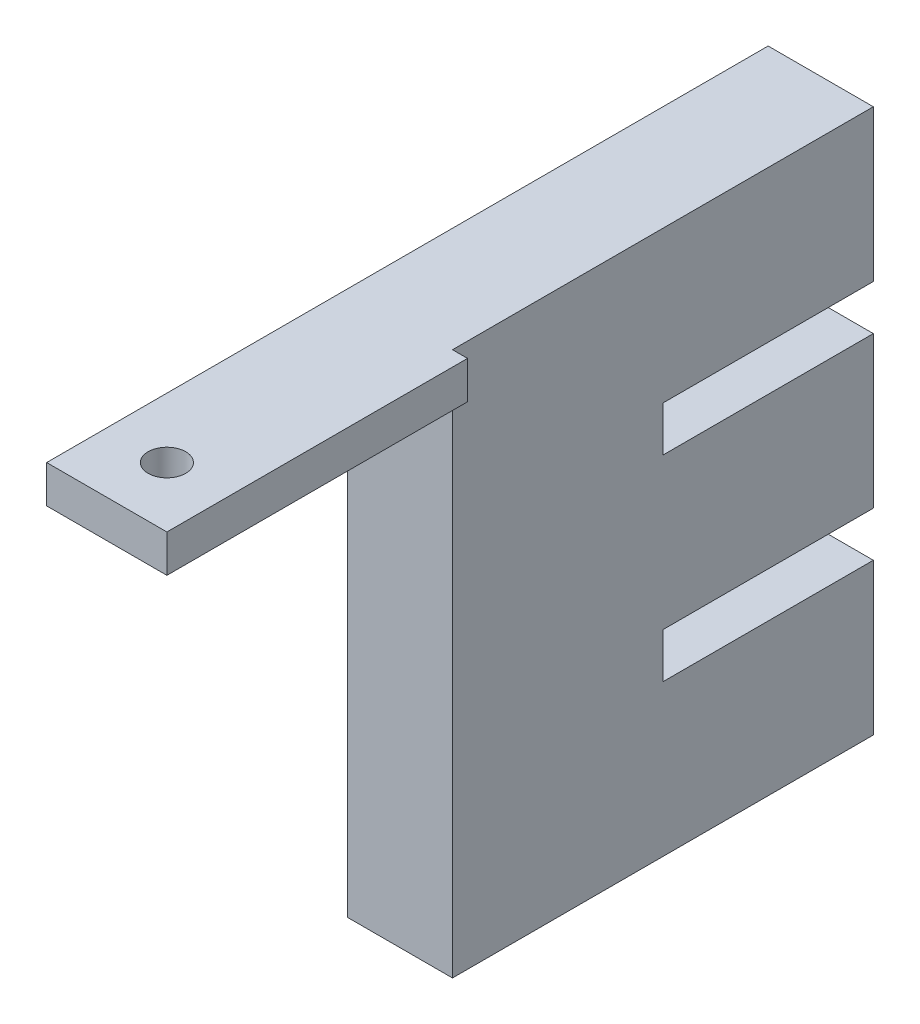
ISO-10303-21;
HEADER;
FILE_DESCRIPTION(('STEP AP214'),'2;1');
FILE_NAME('part.step','',(''),(''),'','','');
FILE_SCHEMA(('AUTOMOTIVE_DESIGN { 1 0 10303 214 1 1 1 1 }'));
ENDSEC;
DATA;
#1=APPLICATION_CONTEXT('core data for automotive mechanical design processes');
#2=APPLICATION_PROTOCOL_DEFINITION('international standard','automotive_design',2000,#1);
#3=PRODUCT_CONTEXT('',#1,'mechanical');
#4=PRODUCT('Part','Part','',(#3));
#5=PRODUCT_RELATED_PRODUCT_CATEGORY('part','',(#4));
#6=PRODUCT_DEFINITION_FORMATION('','',#4);
#7=PRODUCT_DEFINITION_CONTEXT('part definition',#1,'design');
#8=PRODUCT_DEFINITION('design','',#6,#7);
#9=PRODUCT_DEFINITION_SHAPE('','',#8);
#10=(LENGTH_UNIT() NAMED_UNIT(*) SI_UNIT(.MILLI.,.METRE.));
#11=(NAMED_UNIT(*) PLANE_ANGLE_UNIT() SI_UNIT($,.RADIAN.));
#12=(NAMED_UNIT(*) SI_UNIT($,.STERADIAN.) SOLID_ANGLE_UNIT());
#13=UNCERTAINTY_MEASURE_WITH_UNIT(LENGTH_MEASURE(1.E-05),#10,'distance_accuracy_value','');
#14=(GEOMETRIC_REPRESENTATION_CONTEXT(3) GLOBAL_UNCERTAINTY_ASSIGNED_CONTEXT((#13)) GLOBAL_UNIT_ASSIGNED_CONTEXT((#10,
#11,#12)) REPRESENTATION_CONTEXT('',''));
#15=CARTESIAN_POINT('',(0.,0.,0.));
#16=DIRECTION('',(0.,0.,1.));
#17=DIRECTION('',(1.,0.,0.));
#18=AXIS2_PLACEMENT_3D('',#15,#16,#17);
#19=CARTESIAN_POINT('',(-4.,4.5,4.));
#20=DIRECTION('',(1.,0.,0.));
#21=DIRECTION('',(0.,0.,-1.));
#22=AXIS2_PLACEMENT_3D('',#19,#20,#21);
#23=PLANE('',#22);
#24=DIRECTION('',(0.,0.,1.));
#25=VECTOR('',#24,1.);
#26=CARTESIAN_POINT('',(-4.,-21.63,4.));
#27=LINE('',#26,#25);
#28=CARTESIAN_POINT('',(-4.,-21.63,-44.));
#29=VERTEX_POINT('',#28);
#30=CARTESIAN_POINT('',(-4.,-21.63,-30.));
#31=VERTEX_POINT('',#30);
#32=EDGE_CURVE('E172',#29,#31,#27,.T.);
#33=ORIENTED_EDGE('',*,*,#32,.F.);
#34=DIRECTION('',(0.,-1.,0.));
#35=VECTOR('',#34,1.);
#36=CARTESIAN_POINT('',(-4.,4.5,-44.));
#37=LINE('',#36,#35);
#38=CARTESIAN_POINT('',(-4.,-31.7,-44.));
#39=VERTEX_POINT('',#38);
#40=EDGE_CURVE('E200',#29,#39,#37,.T.);
#41=ORIENTED_EDGE('',*,*,#40,.T.);
#42=DIRECTION('',(0.,0.,-1.));
#43=VECTOR('',#42,1.);
#44=CARTESIAN_POINT('',(-4.,-31.7,-16.));
#45=LINE('',#44,#43);
#46=CARTESIAN_POINT('',(-4.,-31.7,-16.));
#47=VERTEX_POINT('',#46);
#48=EDGE_CURVE('E223',#47,#39,#45,.T.);
#49=ORIENTED_EDGE('',*,*,#48,.F.);
#50=DIRECTION('',(0.,-1.,0.));
#51=VECTOR('',#50,1.);
#52=CARTESIAN_POINT('',(-4.,4.5,-16.));
#53=LINE('',#52,#51);
#54=CARTESIAN_POINT('',(-4.,2.,-16.));
#55=VERTEX_POINT('',#54);
#56=EDGE_CURVE('E199',#55,#47,#53,.T.);
#57=ORIENTED_EDGE('',*,*,#56,.F.);
#58=DIRECTION('',(0.,0.,-1.));
#59=VECTOR('',#58,1.);
#60=CARTESIAN_POINT('',(-4.,2.,4.));
#61=LINE('',#60,#59);
#62=CARTESIAN_POINT('',(-4.,2.,4.));
#63=VERTEX_POINT('',#62);
#64=EDGE_CURVE('E255',#63,#55,#61,.T.);
#65=ORIENTED_EDGE('',*,*,#64,.F.);
#66=DIRECTION('',(0.,-1.,0.));
#67=VECTOR('',#66,1.);
#68=CARTESIAN_POINT('',(-4.,4.5,4.));
#69=LINE('',#68,#67);
#70=CARTESIAN_POINT('',(-4.,4.5,4.));
#71=VERTEX_POINT('',#70);
#72=EDGE_CURVE('E230',#71,#63,#69,.T.);
#73=ORIENTED_EDGE('',*,*,#72,.F.);
#74=DIRECTION('',(0.,0.,-1.));
#75=VECTOR('',#74,1.);
#76=CARTESIAN_POINT('',(-4.,4.5,4.));
#77=LINE('',#76,#75);
#78=CARTESIAN_POINT('',(-4.,4.5,-44.));
#79=VERTEX_POINT('',#78);
#80=EDGE_CURVE('E239',#71,#79,#77,.T.);
#81=ORIENTED_EDGE('',*,*,#80,.T.);
#82=CARTESIAN_POINT('',(-4.,-5.57,-44.));
#83=VERTEX_POINT('',#82);
#84=EDGE_CURVE('E209',#79,#83,#37,.T.);
#85=ORIENTED_EDGE('',*,*,#84,.T.);
#86=DIRECTION('',(0.,0.,-1.));
#87=VECTOR('',#86,1.);
#88=CARTESIAN_POINT('',(-4.,-5.57,4.));
#89=LINE('',#88,#87);
#90=CARTESIAN_POINT('',(-4.,-5.57,-30.));
#91=VERTEX_POINT('',#90);
#92=EDGE_CURVE('E63',#91,#83,#89,.T.);
#93=ORIENTED_EDGE('',*,*,#92,.F.);
#94=DIRECTION('',(0.,-1.,0.));
#95=VECTOR('',#94,1.);
#96=CARTESIAN_POINT('',(-4.,4.5,-30.));
#97=LINE('',#96,#95);
#98=CARTESIAN_POINT('',(-4.,-8.57,-30.));
#99=VERTEX_POINT('',#98);
#100=EDGE_CURVE('E192',#91,#99,#97,.T.);
#101=ORIENTED_EDGE('',*,*,#100,.T.);
#102=DIRECTION('',(0.,0.,1.));
#103=VECTOR('',#102,1.);
#104=CARTESIAN_POINT('',(-4.,-8.57,4.));
#105=LINE('',#104,#103);
#106=CARTESIAN_POINT('',(-4.,-8.57,-44.));
#107=VERTEX_POINT('',#106);
#108=EDGE_CURVE('E186',#107,#99,#105,.T.);
#109=ORIENTED_EDGE('',*,*,#108,.F.);
#110=CARTESIAN_POINT('',(-4.,-18.63,-44.));
#111=VERTEX_POINT('',#110);
#112=EDGE_CURVE('E212',#107,#111,#37,.T.);
#113=ORIENTED_EDGE('',*,*,#112,.T.);
#114=DIRECTION('',(0.,0.,-1.));
#115=VECTOR('',#114,1.);
#116=CARTESIAN_POINT('',(-4.,-18.63,4.));
#117=LINE('',#116,#115);
#118=CARTESIAN_POINT('',(-4.,-18.63,-30.));
#119=VERTEX_POINT('',#118);
#120=EDGE_CURVE('E52',#119,#111,#117,.T.);
#121=ORIENTED_EDGE('',*,*,#120,.F.);
#122=DIRECTION('',(0.,-1.,0.));
#123=VECTOR('',#122,1.);
#124=CARTESIAN_POINT('',(-4.,4.5,-30.));
#125=LINE('',#124,#123);
#126=EDGE_CURVE('E161',#119,#31,#125,.T.);
#127=ORIENTED_EDGE('',*,*,#126,.T.);
#128=EDGE_LOOP('',(#33,#41,#49,#57,#65,#73,#81,#85,#93,#101,#109,#113,#121,#127));
#129=FACE_BOUND('',#128,.T.);
#130=ADVANCED_FACE('F39',(#129),#23,.F.);
#131=CARTESIAN_POINT('',(3.,-31.7,-16.));
#132=DIRECTION('',(-1.,0.,0.));
#133=DIRECTION('',(0.,0.,1.));
#134=AXIS2_PLACEMENT_3D('',#131,#132,#133);
#135=PLANE('',#134);
#136=DIRECTION('',(0.,0.,-1.));
#137=VECTOR('',#136,1.);
#138=CARTESIAN_POINT('',(3.,-21.63,-16.));
#139=LINE('',#138,#137);
#140=CARTESIAN_POINT('',(3.,-21.63,-30.));
#141=VERTEX_POINT('',#140);
#142=CARTESIAN_POINT('',(3.,-21.63,-44.));
#143=VERTEX_POINT('',#142);
#144=EDGE_CURVE('E170',#141,#143,#139,.T.);
#145=ORIENTED_EDGE('',*,*,#144,.F.);
#146=DIRECTION('',(0.,1.,0.));
#147=VECTOR('',#146,1.);
#148=CARTESIAN_POINT('',(3.,-31.7,-30.));
#149=LINE('',#148,#147);
#150=CARTESIAN_POINT('',(3.,-18.63,-30.));
#151=VERTEX_POINT('',#150);
#152=EDGE_CURVE('E11',#141,#151,#149,.T.);
#153=ORIENTED_EDGE('',*,*,#152,.T.);
#154=DIRECTION('',(0.,0.,1.));
#155=VECTOR('',#154,1.);
#156=CARTESIAN_POINT('',(3.,-18.63,-16.));
#157=LINE('',#156,#155);
#158=CARTESIAN_POINT('',(3.,-18.63,-44.));
#159=VERTEX_POINT('',#158);
#160=EDGE_CURVE('E146',#159,#151,#157,.T.);
#161=ORIENTED_EDGE('',*,*,#160,.F.);
#162=DIRECTION('',(0.,1.,0.));
#163=VECTOR('',#162,1.);
#164=CARTESIAN_POINT('',(3.,-31.7,-44.));
#165=LINE('',#164,#163);
#166=CARTESIAN_POINT('',(3.,-8.57,-44.));
#167=VERTEX_POINT('',#166);
#168=EDGE_CURVE('E217',#159,#167,#165,.T.);
#169=ORIENTED_EDGE('',*,*,#168,.T.);
#170=DIRECTION('',(0.,0.,-1.));
#171=VECTOR('',#170,1.);
#172=CARTESIAN_POINT('',(3.,-8.57,-16.));
#173=LINE('',#172,#171);
#174=CARTESIAN_POINT('',(3.,-8.57,-30.));
#175=VERTEX_POINT('',#174);
#176=EDGE_CURVE('E189',#175,#167,#173,.T.);
#177=ORIENTED_EDGE('',*,*,#176,.F.);
#178=DIRECTION('',(0.,1.,0.));
#179=VECTOR('',#178,1.);
#180=CARTESIAN_POINT('',(3.,-31.7,-30.));
#181=LINE('',#180,#179);
#182=CARTESIAN_POINT('',(3.,-5.57,-30.));
#183=VERTEX_POINT('',#182);
#184=EDGE_CURVE('E263',#175,#183,#181,.T.);
#185=ORIENTED_EDGE('',*,*,#184,.T.);
#186=DIRECTION('',(0.,0.,1.));
#187=VECTOR('',#186,1.);
#188=CARTESIAN_POINT('',(3.,-5.57,-16.));
#189=LINE('',#188,#187);
#190=CARTESIAN_POINT('',(3.,-5.57,-44.));
#191=VERTEX_POINT('',#190);
#192=EDGE_CURVE('E184',#191,#183,#189,.T.);
#193=ORIENTED_EDGE('',*,*,#192,.F.);
#194=CARTESIAN_POINT('',(3.,4.5,-44.));
#195=VERTEX_POINT('',#194);
#196=EDGE_CURVE('E216',#191,#195,#165,.T.);
#197=ORIENTED_EDGE('',*,*,#196,.T.);
#198=DIRECTION('',(0.,0.,-1.));
#199=VECTOR('',#198,1.);
#200=CARTESIAN_POINT('',(3.,4.5,-16.));
#201=LINE('',#200,#199);
#202=CARTESIAN_POINT('',(3.,4.5,-16.));
#203=VERTEX_POINT('',#202);
#204=EDGE_CURVE('E208',#203,#195,#201,.T.);
#205=ORIENTED_EDGE('',*,*,#204,.F.);
#206=DIRECTION('',(0.,1.,0.));
#207=VECTOR('',#206,1.);
#208=CARTESIAN_POINT('',(3.,-31.7,-16.));
#209=LINE('',#208,#207);
#210=CARTESIAN_POINT('',(3.,2.,-16.));
#211=VERTEX_POINT('',#210);
#212=EDGE_CURVE('E207',#211,#203,#209,.T.);
#213=ORIENTED_EDGE('',*,*,#212,.F.);
#214=CARTESIAN_POINT('',(3.,-31.7,-16.));
#215=VERTEX_POINT('',#214);
#216=EDGE_CURVE('E202',#215,#211,#209,.T.);
#217=ORIENTED_EDGE('',*,*,#216,.F.);
#218=DIRECTION('',(0.,0.,-1.));
#219=VECTOR('',#218,1.);
#220=CARTESIAN_POINT('',(3.,-31.7,-16.));
#221=LINE('',#220,#219);
#222=CARTESIAN_POINT('',(3.,-31.7,-44.));
#223=VERTEX_POINT('',#222);
#224=EDGE_CURVE('E224',#215,#223,#221,.T.);
#225=ORIENTED_EDGE('',*,*,#224,.T.);
#226=EDGE_CURVE('E168',#223,#143,#165,.T.);
#227=ORIENTED_EDGE('',*,*,#226,.T.);
#228=EDGE_LOOP('',(#145,#153,#161,#169,#177,#185,#193,#197,#205,#213,#217,#225,#227));
#229=FACE_BOUND('',#228,.T.);
#230=ADVANCED_FACE('F164',(#229),#135,.F.);
#231=CARTESIAN_POINT('',(0.,0.,-44.));
#232=DIRECTION('',(0.,0.,1.));
#233=DIRECTION('',(1.,0.,0.));
#234=AXIS2_PLACEMENT_3D('',#231,#232,#233);
#235=PLANE('',#234);
#236=DIRECTION('',(-1.,0.,0.));
#237=VECTOR('',#236,1.);
#238=CARTESIAN_POINT('',(0.,-21.63,-44.));
#239=LINE('',#238,#237);
#240=EDGE_CURVE('E46',#143,#29,#239,.T.);
#241=ORIENTED_EDGE('',*,*,#240,.F.);
#242=ORIENTED_EDGE('',*,*,#226,.F.);
#243=DIRECTION('',(1.,0.,0.));
#244=VECTOR('',#243,1.);
#245=CARTESIAN_POINT('',(-4.,-31.7,-44.));
#246=LINE('',#245,#244);
#247=EDGE_CURVE('E213',#39,#223,#246,.T.);
#248=ORIENTED_EDGE('',*,*,#247,.F.);
#249=ORIENTED_EDGE('',*,*,#40,.F.);
#250=EDGE_LOOP('',(#241,#242,#248,#249));
#251=FACE_BOUND('',#250,.T.);
#252=ADVANCED_FACE('F272',(#251),#235,.F.);
#253=DIRECTION('',(1.,0.,0.));
#254=VECTOR('',#253,1.);
#255=CARTESIAN_POINT('',(0.,-18.63,-44.));
#256=LINE('',#255,#254);
#257=EDGE_CURVE('E155',#111,#159,#256,.T.);
#258=ORIENTED_EDGE('',*,*,#257,.F.);
#259=ORIENTED_EDGE('',*,*,#112,.F.);
#260=DIRECTION('',(-1.,0.,0.));
#261=VECTOR('',#260,1.);
#262=CARTESIAN_POINT('',(0.,-8.57,-44.));
#263=LINE('',#262,#261);
#264=EDGE_CURVE('E261',#167,#107,#263,.T.);
#265=ORIENTED_EDGE('',*,*,#264,.F.);
#266=ORIENTED_EDGE('',*,*,#168,.F.);
#267=EDGE_LOOP('',(#258,#259,#265,#266));
#268=FACE_BOUND('',#267,.T.);
#269=ADVANCED_FACE('F276',(#268),#235,.F.);
#270=DIRECTION('',(1.,0.,0.));
#271=VECTOR('',#270,1.);
#272=CARTESIAN_POINT('',(0.,-5.57,-44.));
#273=LINE('',#272,#271);
#274=EDGE_CURVE('E259',#83,#191,#273,.T.);
#275=ORIENTED_EDGE('',*,*,#274,.F.);
#276=ORIENTED_EDGE('',*,*,#84,.F.);
#277=DIRECTION('',(-1.,0.,0.));
#278=VECTOR('',#277,1.);
#279=CARTESIAN_POINT('',(3.,4.5,-44.));
#280=LINE('',#279,#278);
#281=EDGE_CURVE('E201',#195,#79,#280,.T.);
#282=ORIENTED_EDGE('',*,*,#281,.F.);
#283=ORIENTED_EDGE('',*,*,#196,.F.);
#284=EDGE_LOOP('',(#275,#276,#282,#283));
#285=FACE_BOUND('',#284,.T.);
#286=ADVANCED_FACE('F292',(#285),#235,.F.);
#287=CARTESIAN_POINT('',(-4.,2.,4.));
#288=DIRECTION('',(0.,1.,0.));
#289=DIRECTION('',(0.,0.,1.));
#290=AXIS2_PLACEMENT_3D('',#287,#288,#289);
#291=PLANE('',#290);
#292=CARTESIAN_POINT('',(0.,2.,0.));
#293=DIRECTION('',(0.,1.,0.));
#294=DIRECTION('',(0.,0.,1.));
#295=AXIS2_PLACEMENT_3D('',#292,#293,#294);
#296=CIRCLE('',#295,1.25);
#297=CARTESIAN_POINT('',(0.,2.,1.25));
#298=VERTEX_POINT('',#297);
#299=EDGE_CURVE('E198',#298,#298,#296,.F.);
#300=ORIENTED_EDGE('',*,*,#299,.F.);
#301=EDGE_LOOP('',(#300));
#302=FACE_BOUND('',#301,.T.);
#303=DIRECTION('',(1.,0.,0.));
#304=VECTOR('',#303,1.);
#305=CARTESIAN_POINT('',(-4.,2.,-16.));
#306=LINE('',#305,#304);
#307=EDGE_CURVE('E238',#55,#211,#306,.T.);
#308=ORIENTED_EDGE('',*,*,#307,.T.);
#309=CARTESIAN_POINT('',(4.,2.,-16.));
#310=VERTEX_POINT('',#309);
#311=EDGE_CURVE('E227',#211,#310,#306,.T.);
#312=ORIENTED_EDGE('',*,*,#311,.T.);
#313=DIRECTION('',(0.,0.,-1.));
#314=VECTOR('',#313,1.);
#315=CARTESIAN_POINT('',(4.,2.,4.));
#316=LINE('',#315,#314);
#317=CARTESIAN_POINT('',(4.,2.,4.));
#318=VERTEX_POINT('',#317);
#319=EDGE_CURVE('E253',#318,#310,#316,.T.);
#320=ORIENTED_EDGE('',*,*,#319,.F.);
#321=DIRECTION('',(1.,0.,0.));
#322=VECTOR('',#321,1.);
#323=CARTESIAN_POINT('',(-4.,2.,4.));
#324=LINE('',#323,#322);
#325=EDGE_CURVE('E232',#63,#318,#324,.T.);
#326=ORIENTED_EDGE('',*,*,#325,.F.);
#327=ORIENTED_EDGE('',*,*,#64,.T.);
#328=EDGE_LOOP('',(#308,#312,#320,#326,#327));
#329=FACE_BOUND('',#328,.T.);
#330=ADVANCED_FACE('F312',(#302,#329),#291,.F.);
#331=CARTESIAN_POINT('',(4.,2.,4.));
#332=DIRECTION('',(-1.,0.,0.));
#333=DIRECTION('',(0.,0.,1.));
#334=AXIS2_PLACEMENT_3D('',#331,#332,#333);
#335=PLANE('',#334);
#336=DIRECTION('',(0.,1.,0.));
#337=VECTOR('',#336,1.);
#338=CARTESIAN_POINT('',(4.,2.,-16.));
#339=LINE('',#338,#337);
#340=CARTESIAN_POINT('',(4.,4.5,-16.));
#341=VERTEX_POINT('',#340);
#342=EDGE_CURVE('E242',#310,#341,#339,.T.);
#343=ORIENTED_EDGE('',*,*,#342,.T.);
#344=DIRECTION('',(0.,0.,-1.));
#345=VECTOR('',#344,1.);
#346=CARTESIAN_POINT('',(4.,4.5,4.));
#347=LINE('',#346,#345);
#348=CARTESIAN_POINT('',(4.,4.5,4.));
#349=VERTEX_POINT('',#348);
#350=EDGE_CURVE('E249',#349,#341,#347,.T.);
#351=ORIENTED_EDGE('',*,*,#350,.F.);
#352=DIRECTION('',(0.,1.,0.));
#353=VECTOR('',#352,1.);
#354=CARTESIAN_POINT('',(4.,2.,4.));
#355=LINE('',#354,#353);
#356=EDGE_CURVE('E235',#318,#349,#355,.T.);
#357=ORIENTED_EDGE('',*,*,#356,.F.);
#358=ORIENTED_EDGE('',*,*,#319,.T.);
#359=EDGE_LOOP('',(#343,#351,#357,#358));
#360=FACE_BOUND('',#359,.T.);
#361=ADVANCED_FACE('F301',(#360),#335,.F.);
#362=CARTESIAN_POINT('',(4.,4.5,4.));
#363=DIRECTION('',(0.,-1.,0.));
#364=DIRECTION('',(0.,0.,-1.));
#365=AXIS2_PLACEMENT_3D('',#362,#363,#364);
#366=PLANE('',#365);
#367=CARTESIAN_POINT('',(0.,4.5,0.));
#368=DIRECTION('',(0.,-1.,0.));
#369=DIRECTION('',(0.,0.,-1.));
#370=AXIS2_PLACEMENT_3D('',#367,#368,#369);
#371=CIRCLE('',#370,1.25);
#372=CARTESIAN_POINT('',(0.,4.5,-1.25));
#373=VERTEX_POINT('',#372);
#374=EDGE_CURVE('E195',#373,#373,#371,.F.);
#375=ORIENTED_EDGE('',*,*,#374,.F.);
#376=EDGE_LOOP('',(#375));
#377=FACE_BOUND('',#376,.T.);
#378=DIRECTION('',(-1.,0.,0.));
#379=VECTOR('',#378,1.);
#380=CARTESIAN_POINT('',(4.,4.5,-16.));
#381=LINE('',#380,#379);
#382=EDGE_CURVE('E234',#341,#203,#381,.T.);
#383=ORIENTED_EDGE('',*,*,#382,.T.);
#384=ORIENTED_EDGE('',*,*,#204,.T.);
#385=ORIENTED_EDGE('',*,*,#281,.T.);
#386=ORIENTED_EDGE('',*,*,#80,.F.);
#387=DIRECTION('',(-1.,0.,0.));
#388=VECTOR('',#387,1.);
#389=CARTESIAN_POINT('',(4.,4.5,4.));
#390=LINE('',#389,#388);
#391=EDGE_CURVE('E240',#349,#71,#390,.T.);
#392=ORIENTED_EDGE('',*,*,#391,.F.);
#393=ORIENTED_EDGE('',*,*,#350,.T.);
#394=EDGE_LOOP('',(#383,#384,#385,#386,#392,#393));
#395=FACE_BOUND('',#394,.T.);
#396=ADVANCED_FACE('F287',(#377,#395),#366,.F.);
#397=CARTESIAN_POINT('',(0.,0.,4.));
#398=DIRECTION('',(0.,0.,1.));
#399=DIRECTION('',(1.,0.,0.));
#400=AXIS2_PLACEMENT_3D('',#397,#398,#399);
#401=PLANE('',#400);
#402=ORIENTED_EDGE('',*,*,#72,.T.);
#403=ORIENTED_EDGE('',*,*,#325,.T.);
#404=ORIENTED_EDGE('',*,*,#356,.T.);
#405=ORIENTED_EDGE('',*,*,#391,.T.);
#406=EDGE_LOOP('',(#402,#403,#404,#405));
#407=FACE_BOUND('',#406,.T.);
#408=ADVANCED_FACE('F299',(#407),#401,.T.);
#409=CARTESIAN_POINT('',(0.,0.,-16.));
#410=DIRECTION('',(0.,0.,1.));
#411=DIRECTION('',(1.,0.,0.));
#412=AXIS2_PLACEMENT_3D('',#409,#410,#411);
#413=PLANE('',#412);
#414=ORIENTED_EDGE('',*,*,#311,.F.);
#415=ORIENTED_EDGE('',*,*,#212,.T.);
#416=ORIENTED_EDGE('',*,*,#382,.F.);
#417=ORIENTED_EDGE('',*,*,#342,.F.);
#418=EDGE_LOOP('',(#414,#415,#416,#417));
#419=FACE_BOUND('',#418,.T.);
#420=ADVANCED_FACE('F305',(#419),#413,.F.);
#421=CARTESIAN_POINT('',(0.,0.,-16.));
#422=DIRECTION('',(0.,0.,1.));
#423=DIRECTION('',(1.,0.,0.));
#424=AXIS2_PLACEMENT_3D('',#421,#422,#423);
#425=PLANE('',#424);
#426=ORIENTED_EDGE('',*,*,#307,.F.);
#427=ORIENTED_EDGE('',*,*,#56,.T.);
#428=DIRECTION('',(1.,0.,0.));
#429=VECTOR('',#428,1.);
#430=CARTESIAN_POINT('',(-4.,-31.7,-16.));
#431=LINE('',#430,#429);
#432=EDGE_CURVE('E205',#47,#215,#431,.T.);
#433=ORIENTED_EDGE('',*,*,#432,.T.);
#434=ORIENTED_EDGE('',*,*,#216,.T.);
#435=EDGE_LOOP('',(#426,#427,#433,#434));
#436=FACE_BOUND('',#435,.T.);
#437=ADVANCED_FACE('F306',(#436),#425,.T.);
#438=CARTESIAN_POINT('',(-4.,-31.7,-16.));
#439=DIRECTION('',(0.,1.,0.));
#440=DIRECTION('',(0.,0.,1.));
#441=AXIS2_PLACEMENT_3D('',#438,#439,#440);
#442=PLANE('',#441);
#443=ORIENTED_EDGE('',*,*,#247,.T.);
#444=ORIENTED_EDGE('',*,*,#224,.F.);
#445=ORIENTED_EDGE('',*,*,#432,.F.);
#446=ORIENTED_EDGE('',*,*,#48,.T.);
#447=EDGE_LOOP('',(#443,#444,#445,#446));
#448=FACE_BOUND('',#447,.T.);
#449=ADVANCED_FACE('F311',(#448),#442,.F.);
#450=CARTESIAN_POINT('',(0.,4.6,0.));
#451=DIRECTION('',(0.,-1.,0.));
#452=DIRECTION('',(0.,0.,-1.));
#453=AXIS2_PLACEMENT_3D('',#450,#451,#452);
#454=CYLINDRICAL_SURFACE('',#453,1.25);
#455=ORIENTED_EDGE('',*,*,#374,.T.);
#456=EDGE_LOOP('',(#455));
#457=FACE_BOUND('',#456,.T.);
#458=ORIENTED_EDGE('',*,*,#299,.T.);
#459=EDGE_LOOP('',(#458));
#460=FACE_BOUND('',#459,.T.);
#461=ADVANCED_FACE('F340',(#457,#460),#454,.F.);
#462=CARTESIAN_POINT('',(0.,0.,-30.));
#463=DIRECTION('',(0.,0.,1.));
#464=DIRECTION('',(1.,0.,0.));
#465=AXIS2_PLACEMENT_3D('',#462,#463,#464);
#466=PLANE('',#465);
#467=DIRECTION('',(-1.,0.,0.));
#468=VECTOR('',#467,1.);
#469=CARTESIAN_POINT('',(3.1,-5.57,-30.));
#470=LINE('',#469,#468);
#471=EDGE_CURVE('E185',#183,#91,#470,.T.);
#472=ORIENTED_EDGE('',*,*,#471,.F.);
#473=ORIENTED_EDGE('',*,*,#184,.F.);
#474=DIRECTION('',(1.,0.,0.));
#475=VECTOR('',#474,1.);
#476=CARTESIAN_POINT('',(-4.1,-8.57,-30.));
#477=LINE('',#476,#475);
#478=EDGE_CURVE('E178',#99,#175,#477,.T.);
#479=ORIENTED_EDGE('',*,*,#478,.F.);
#480=ORIENTED_EDGE('',*,*,#100,.F.);
#481=EDGE_LOOP('',(#472,#473,#479,#480));
#482=FACE_BOUND('',#481,.T.);
#483=ADVANCED_FACE('F353',(#482),#466,.F.);
#484=CARTESIAN_POINT('',(-4.1,-8.57,-30.));
#485=DIRECTION('',(0.,1.,0.));
#486=DIRECTION('',(0.,0.,1.));
#487=AXIS2_PLACEMENT_3D('',#484,#485,#486);
#488=PLANE('',#487);
#489=ORIENTED_EDGE('',*,*,#108,.T.);
#490=ORIENTED_EDGE('',*,*,#478,.T.);
#491=ORIENTED_EDGE('',*,*,#176,.T.);
#492=ORIENTED_EDGE('',*,*,#264,.T.);
#493=EDGE_LOOP('',(#489,#490,#491,#492));
#494=FACE_BOUND('',#493,.T.);
#495=ADVANCED_FACE('F356',(#494),#488,.T.);
#496=CARTESIAN_POINT('',(3.1,-5.57,-30.));
#497=DIRECTION('',(0.,-1.,0.));
#498=DIRECTION('',(0.,0.,-1.));
#499=AXIS2_PLACEMENT_3D('',#496,#497,#498);
#500=PLANE('',#499);
#501=ORIENTED_EDGE('',*,*,#92,.T.);
#502=ORIENTED_EDGE('',*,*,#274,.T.);
#503=ORIENTED_EDGE('',*,*,#192,.T.);
#504=ORIENTED_EDGE('',*,*,#471,.T.);
#505=EDGE_LOOP('',(#501,#502,#503,#504));
#506=FACE_BOUND('',#505,.T.);
#507=ADVANCED_FACE('F396',(#506),#500,.T.);
#508=CARTESIAN_POINT('',(0.,0.,-30.));
#509=DIRECTION('',(0.,0.,1.));
#510=DIRECTION('',(1.,0.,0.));
#511=AXIS2_PLACEMENT_3D('',#508,#509,#510);
#512=PLANE('',#511);
#513=DIRECTION('',(-1.,0.,0.));
#514=VECTOR('',#513,1.);
#515=CARTESIAN_POINT('',(3.1,-18.63,-30.));
#516=LINE('',#515,#514);
#517=EDGE_CURVE('E151',#151,#119,#516,.T.);
#518=ORIENTED_EDGE('',*,*,#517,.F.);
#519=ORIENTED_EDGE('',*,*,#152,.F.);
#520=DIRECTION('',(1.,0.,0.));
#521=VECTOR('',#520,1.);
#522=CARTESIAN_POINT('',(-4.1,-21.63,-30.));
#523=LINE('',#522,#521);
#524=EDGE_CURVE('E165',#31,#141,#523,.T.);
#525=ORIENTED_EDGE('',*,*,#524,.F.);
#526=ORIENTED_EDGE('',*,*,#126,.F.);
#527=EDGE_LOOP('',(#518,#519,#525,#526));
#528=FACE_BOUND('',#527,.T.);
#529=ADVANCED_FACE('F160',(#528),#512,.F.);
#530=CARTESIAN_POINT('',(-4.1,-21.63,-30.));
#531=DIRECTION('',(0.,1.,0.));
#532=DIRECTION('',(0.,0.,1.));
#533=AXIS2_PLACEMENT_3D('',#530,#531,#532);
#534=PLANE('',#533);
#535=ORIENTED_EDGE('',*,*,#32,.T.);
#536=ORIENTED_EDGE('',*,*,#524,.T.);
#537=ORIENTED_EDGE('',*,*,#144,.T.);
#538=ORIENTED_EDGE('',*,*,#240,.T.);
#539=EDGE_LOOP('',(#535,#536,#537,#538));
#540=FACE_BOUND('',#539,.T.);
#541=ADVANCED_FACE('F270',(#540),#534,.T.);
#542=CARTESIAN_POINT('',(3.1,-18.63,-30.));
#543=DIRECTION('',(0.,-1.,0.));
#544=DIRECTION('',(0.,0.,-1.));
#545=AXIS2_PLACEMENT_3D('',#542,#543,#544);
#546=PLANE('',#545);
#547=ORIENTED_EDGE('',*,*,#120,.T.);
#548=ORIENTED_EDGE('',*,*,#257,.T.);
#549=ORIENTED_EDGE('',*,*,#160,.T.);
#550=ORIENTED_EDGE('',*,*,#517,.T.);
#551=EDGE_LOOP('',(#547,#548,#549,#550));
#552=FACE_BOUND('',#551,.T.);
#553=ADVANCED_FACE('F147',(#552),#546,.T.);
#554=CLOSED_SHELL('',(#130,#230,#252,#269,#286,#330,#361,#396,#408,#420,#437,#449,#461,#483,
#495,#507,#529,#541,#553));
#555=MANIFOLD_SOLID_BREP('B2',#554);
#556=ADVANCED_BREP_SHAPE_REPRESENTATION('',(#18,#555),#14);
#557=SHAPE_DEFINITION_REPRESENTATION(#9,#556);
ENDSEC;
END-ISO-10303-21;
